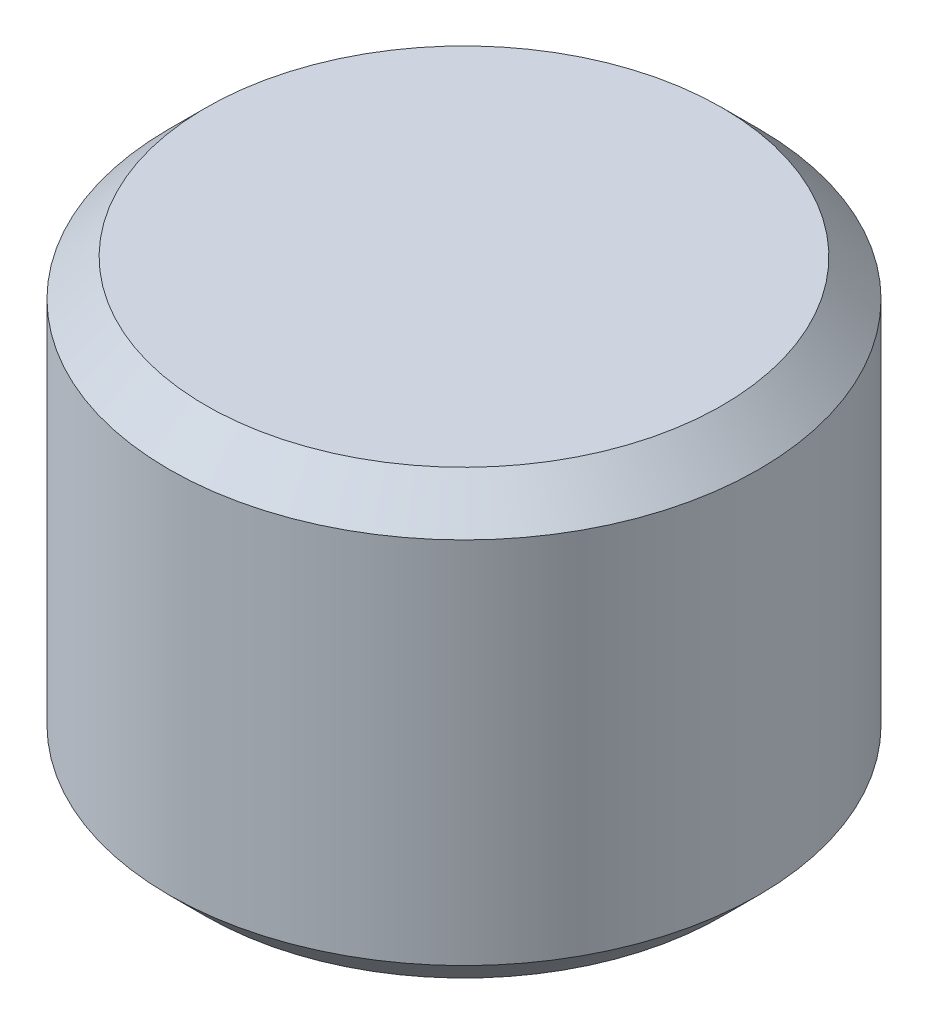
ISO-10303-21;
HEADER;
FILE_DESCRIPTION(('STEP AP214'),'2;1');
FILE_NAME('part.step','',(''),(''),'','','');
FILE_SCHEMA(('AUTOMOTIVE_DESIGN { 1 0 10303 214 1 1 1 1 }'));
ENDSEC;
DATA;
#1=APPLICATION_CONTEXT('core data for automotive mechanical design processes');
#2=APPLICATION_PROTOCOL_DEFINITION('international standard','automotive_design',2000,#1);
#3=PRODUCT_CONTEXT('',#1,'mechanical');
#4=PRODUCT('Part','Part','',(#3));
#5=PRODUCT_RELATED_PRODUCT_CATEGORY('part','',(#4));
#6=PRODUCT_DEFINITION_FORMATION('','',#4);
#7=PRODUCT_DEFINITION_CONTEXT('part definition',#1,'design');
#8=PRODUCT_DEFINITION('design','',#6,#7);
#9=PRODUCT_DEFINITION_SHAPE('','',#8);
#10=(LENGTH_UNIT() NAMED_UNIT(*) SI_UNIT(.MILLI.,.METRE.));
#11=(NAMED_UNIT(*) PLANE_ANGLE_UNIT() SI_UNIT($,.RADIAN.));
#12=(NAMED_UNIT(*) SI_UNIT($,.STERADIAN.) SOLID_ANGLE_UNIT());
#13=UNCERTAINTY_MEASURE_WITH_UNIT(LENGTH_MEASURE(1.E-05),#10,'distance_accuracy_value','');
#14=(GEOMETRIC_REPRESENTATION_CONTEXT(3) GLOBAL_UNCERTAINTY_ASSIGNED_CONTEXT((#13)) GLOBAL_UNIT_ASSIGNED_CONTEXT((#10,
#11,#12)) REPRESENTATION_CONTEXT('',''));
#15=CARTESIAN_POINT('',(0.,0.,0.));
#16=DIRECTION('',(0.,0.,1.));
#17=DIRECTION('',(1.,0.,0.));
#18=AXIS2_PLACEMENT_3D('',#15,#16,#17);
#19=CARTESIAN_POINT('',(0.,0.,0.));
#20=DIRECTION('',(0.,-1.,0.));
#21=DIRECTION('',(0.,0.,-1.));
#22=AXIS2_PLACEMENT_3D('',#19,#20,#21);
#23=PLANE('',#22);
#24=CARTESIAN_POINT('',(0.,0.,0.));
#25=DIRECTION('',(0.,-1.,0.));
#26=DIRECTION('',(0.,0.,-1.));
#27=AXIS2_PLACEMENT_3D('',#24,#25,#26);
#28=CIRCLE('',#27,3.5);
#29=CARTESIAN_POINT('',(0.,0.,-3.5));
#30=VERTEX_POINT('',#29);
#31=EDGE_CURVE('E139',#30,#30,#28,.F.);
#32=ORIENTED_EDGE('',*,*,#31,.T.);
#33=EDGE_LOOP('',(#32));
#34=FACE_BOUND('',#33,.T.);
#35=ADVANCED_FACE('F37',(#34),#23,.F.);
#36=CARTESIAN_POINT('',(0.,0.,0.));
#37=DIRECTION('',(0.,1.,0.));
#38=DIRECTION('',(0.,0.,1.));
#39=AXIS2_PLACEMENT_3D('',#36,#37,#38);
#40=CYLINDRICAL_SURFACE('',#39,4.);
#41=CARTESIAN_POINT('',(0.,-0.500000000000004,0.));
#42=DIRECTION('',(0.,-1.,0.));
#43=DIRECTION('',(0.,0.,-1.));
#44=AXIS2_PLACEMENT_3D('',#41,#42,#43);
#45=CIRCLE('',#44,4.);
#46=CARTESIAN_POINT('',(0.,-0.500000000000004,-4.));
#47=VERTEX_POINT('',#46);
#48=EDGE_CURVE('E45',#47,#47,#45,.T.);
#49=ORIENTED_EDGE('',*,*,#48,.T.);
#50=EDGE_LOOP('',(#49));
#51=FACE_BOUND('',#50,.T.);
#52=CARTESIAN_POINT('',(0.,-5.5,0.));
#53=DIRECTION('',(0.,1.,0.));
#54=DIRECTION('',(0.,0.,1.));
#55=AXIS2_PLACEMENT_3D('',#52,#53,#54);
#56=CIRCLE('',#55,4.);
#57=CARTESIAN_POINT('',(0.,-5.5,4.));
#58=VERTEX_POINT('',#57);
#59=EDGE_CURVE('E147',#58,#58,#56,.T.);
#60=ORIENTED_EDGE('',*,*,#59,.T.);
#61=EDGE_LOOP('',(#60));
#62=FACE_BOUND('',#61,.T.);
#63=ADVANCED_FACE('F152',(#51,#62),#40,.T.);
#64=CARTESIAN_POINT('',(4.,-6.,0.));
#65=DIRECTION('',(0.,1.,0.));
#66=DIRECTION('',(0.,0.,1.));
#67=AXIS2_PLACEMENT_3D('',#64,#65,#66);
#68=PLANE('',#67);
#69=DIRECTION('',(1.,0.,0.));
#70=VECTOR('',#69,1.);
#71=CARTESIAN_POINT('',(-1.15470053837925,-6.,-2.));
#72=LINE('',#71,#70);
#73=CARTESIAN_POINT('',(-1.15470053837925,-6.,-2.));
#74=VERTEX_POINT('',#73);
#75=CARTESIAN_POINT('',(1.15470053837925,-6.,-2.));
#76=VERTEX_POINT('',#75);
#77=EDGE_CURVE('E126',#74,#76,#72,.T.);
#78=ORIENTED_EDGE('',*,*,#77,.F.);
#79=DIRECTION('',(0.5,0.,-0.866025403784439));
#80=VECTOR('',#79,1.);
#81=CARTESIAN_POINT('',(-2.3094010767585,-6.,0.));
#82=LINE('',#81,#80);
#83=CARTESIAN_POINT('',(-2.3094010767585,-6.,0.));
#84=VERTEX_POINT('',#83);
#85=EDGE_CURVE('E52',#84,#74,#82,.T.);
#86=ORIENTED_EDGE('',*,*,#85,.F.);
#87=DIRECTION('',(-0.5,0.,-0.866025403784439));
#88=VECTOR('',#87,1.);
#89=CARTESIAN_POINT('',(-1.15470053837925,-6.,2.));
#90=LINE('',#89,#88);
#91=CARTESIAN_POINT('',(-1.15470053837925,-6.,2.));
#92=VERTEX_POINT('',#91);
#93=EDGE_CURVE('E135',#92,#84,#90,.T.);
#94=ORIENTED_EDGE('',*,*,#93,.F.);
#95=DIRECTION('',(-1.,0.,0.));
#96=VECTOR('',#95,1.);
#97=CARTESIAN_POINT('',(1.15470053837925,-6.,2.));
#98=LINE('',#97,#96);
#99=CARTESIAN_POINT('',(1.15470053837925,-6.,2.));
#100=VERTEX_POINT('',#99);
#101=EDGE_CURVE('E133',#100,#92,#98,.T.);
#102=ORIENTED_EDGE('',*,*,#101,.F.);
#103=DIRECTION('',(-0.5,0.,0.866025403784439));
#104=VECTOR('',#103,1.);
#105=CARTESIAN_POINT('',(2.3094010767585,-6.,0.));
#106=LINE('',#105,#104);
#107=CARTESIAN_POINT('',(2.3094010767585,-6.,0.));
#108=VERTEX_POINT('',#107);
#109=EDGE_CURVE('E100',#108,#100,#106,.T.);
#110=ORIENTED_EDGE('',*,*,#109,.F.);
#111=DIRECTION('',(0.5,0.,0.866025403784439));
#112=VECTOR('',#111,1.);
#113=CARTESIAN_POINT('',(1.15470053837925,-6.,-2.));
#114=LINE('',#113,#112);
#115=EDGE_CURVE('E129',#76,#108,#114,.T.);
#116=ORIENTED_EDGE('',*,*,#115,.F.);
#117=EDGE_LOOP('',(#78,#86,#94,#102,#110,#116));
#118=FACE_BOUND('',#117,.T.);
#119=CARTESIAN_POINT('',(0.,-6.,0.));
#120=DIRECTION('',(0.,1.,0.));
#121=DIRECTION('',(0.,0.,1.));
#122=AXIS2_PLACEMENT_3D('',#119,#120,#121);
#123=CIRCLE('',#122,3.5);
#124=CARTESIAN_POINT('',(0.,-6.,3.5));
#125=VERTEX_POINT('',#124);
#126=EDGE_CURVE('E11',#125,#125,#123,.F.);
#127=ORIENTED_EDGE('',*,*,#126,.T.);
#128=EDGE_LOOP('',(#127));
#129=FACE_BOUND('',#128,.T.);
#130=ADVANCED_FACE('F158',(#118,#129),#68,.F.);
#131=CARTESIAN_POINT('',(0.,0.,0.));
#132=DIRECTION('',(0.,-1.,0.));
#133=DIRECTION('',(0.,0.,-1.));
#134=AXIS2_PLACEMENT_3D('',#131,#132,#133);
#135=CONICAL_SURFACE('',#134,3.5,0.785398163397447);
#136=ORIENTED_EDGE('',*,*,#48,.F.);
#137=EDGE_LOOP('',(#136));
#138=FACE_BOUND('',#137,.T.);
#139=ORIENTED_EDGE('',*,*,#31,.F.);
#140=EDGE_LOOP('',(#139));
#141=FACE_BOUND('',#140,.T.);
#142=ADVANCED_FACE('F155',(#138,#141),#135,.T.);
#143=CARTESIAN_POINT('',(0.,-5.5,0.));
#144=DIRECTION('',(0.,1.,0.));
#145=DIRECTION('',(0.,0.,1.));
#146=AXIS2_PLACEMENT_3D('',#143,#144,#145);
#147=CONICAL_SURFACE('',#146,4.,0.78539816339745);
#148=ORIENTED_EDGE('',*,*,#126,.F.);
#149=EDGE_LOOP('',(#148));
#150=FACE_BOUND('',#149,.T.);
#151=ORIENTED_EDGE('',*,*,#59,.F.);
#152=EDGE_LOOP('',(#151));
#153=FACE_BOUND('',#152,.T.);
#154=ADVANCED_FACE('F39',(#150,#153),#147,.T.);
#155=CARTESIAN_POINT('',(-2.3094010767585,-2.,0.));
#156=DIRECTION('',(-0.866025403784439,0.,-0.5));
#157=DIRECTION('',(-0.5,0.,0.866025403784439));
#158=AXIS2_PLACEMENT_3D('',#155,#156,#157);
#159=PLANE('',#158);
#160=ORIENTED_EDGE('',*,*,#85,.T.);
#161=DIRECTION('',(0.,-1.,0.));
#162=VECTOR('',#161,1.);
#163=CARTESIAN_POINT('',(-1.15470053837925,-2.,-2.));
#164=LINE('',#163,#162);
#165=CARTESIAN_POINT('',(-1.15470053837925,-2.,-2.));
#166=VERTEX_POINT('',#165);
#167=EDGE_CURVE('E82',#166,#74,#164,.T.);
#168=ORIENTED_EDGE('',*,*,#167,.F.);
#169=DIRECTION('',(0.5,0.,-0.866025403784439));
#170=VECTOR('',#169,1.);
#171=CARTESIAN_POINT('',(-2.3094010767585,-2.,0.));
#172=LINE('',#171,#170);
#173=CARTESIAN_POINT('',(-2.3094010767585,-2.,0.));
#174=VERTEX_POINT('',#173);
#175=EDGE_CURVE('E137',#174,#166,#172,.T.);
#176=ORIENTED_EDGE('',*,*,#175,.F.);
#177=DIRECTION('',(0.,-1.,0.));
#178=VECTOR('',#177,1.);
#179=CARTESIAN_POINT('',(-2.3094010767585,-2.,0.));
#180=LINE('',#179,#178);
#181=EDGE_CURVE('E60',#174,#84,#180,.T.);
#182=ORIENTED_EDGE('',*,*,#181,.T.);
#183=EDGE_LOOP('',(#160,#168,#176,#182));
#184=FACE_BOUND('',#183,.T.);
#185=ADVANCED_FACE('F171',(#184),#159,.F.);
#186=CARTESIAN_POINT('',(-1.15470053837925,-2.,2.));
#187=DIRECTION('',(-0.866025403784439,0.,0.5));
#188=DIRECTION('',(0.5,0.,0.866025403784439));
#189=AXIS2_PLACEMENT_3D('',#186,#187,#188);
#190=PLANE('',#189);
#191=ORIENTED_EDGE('',*,*,#93,.T.);
#192=ORIENTED_EDGE('',*,*,#181,.F.);
#193=DIRECTION('',(-0.5,0.,-0.866025403784439));
#194=VECTOR('',#193,1.);
#195=CARTESIAN_POINT('',(-1.15470053837925,-2.,2.));
#196=LINE('',#195,#194);
#197=CARTESIAN_POINT('',(-1.15470053837925,-2.,2.));
#198=VERTEX_POINT('',#197);
#199=EDGE_CURVE('E112',#198,#174,#196,.T.);
#200=ORIENTED_EDGE('',*,*,#199,.F.);
#201=DIRECTION('',(0.,-1.,0.));
#202=VECTOR('',#201,1.);
#203=CARTESIAN_POINT('',(-1.15470053837925,-2.,2.));
#204=LINE('',#203,#202);
#205=EDGE_CURVE('E104',#198,#92,#204,.T.);
#206=ORIENTED_EDGE('',*,*,#205,.T.);
#207=EDGE_LOOP('',(#191,#192,#200,#206));
#208=FACE_BOUND('',#207,.T.);
#209=ADVANCED_FACE('F174',(#208),#190,.F.);
#210=CARTESIAN_POINT('',(1.15470053837925,-2.,2.));
#211=DIRECTION('',(0.,0.,1.));
#212=DIRECTION('',(1.,0.,0.));
#213=AXIS2_PLACEMENT_3D('',#210,#211,#212);
#214=PLANE('',#213);
#215=ORIENTED_EDGE('',*,*,#101,.T.);
#216=ORIENTED_EDGE('',*,*,#205,.F.);
#217=DIRECTION('',(-1.,0.,0.));
#218=VECTOR('',#217,1.);
#219=CARTESIAN_POINT('',(1.15470053837925,-2.,2.));
#220=LINE('',#219,#218);
#221=CARTESIAN_POINT('',(1.15470053837925,-2.,2.));
#222=VERTEX_POINT('',#221);
#223=EDGE_CURVE('E108',#222,#198,#220,.T.);
#224=ORIENTED_EDGE('',*,*,#223,.F.);
#225=DIRECTION('',(0.,-1.,0.));
#226=VECTOR('',#225,1.);
#227=CARTESIAN_POINT('',(1.15470053837925,-2.,2.));
#228=LINE('',#227,#226);
#229=EDGE_CURVE('E93',#222,#100,#228,.T.);
#230=ORIENTED_EDGE('',*,*,#229,.T.);
#231=EDGE_LOOP('',(#215,#216,#224,#230));
#232=FACE_BOUND('',#231,.T.);
#233=ADVANCED_FACE('F109',(#232),#214,.F.);
#234=CARTESIAN_POINT('',(2.3094010767585,-2.,0.));
#235=DIRECTION('',(0.866025403784439,0.,0.5));
#236=DIRECTION('',(0.5,0.,-0.866025403784439));
#237=AXIS2_PLACEMENT_3D('',#234,#235,#236);
#238=PLANE('',#237);
#239=ORIENTED_EDGE('',*,*,#109,.T.);
#240=ORIENTED_EDGE('',*,*,#229,.F.);
#241=DIRECTION('',(-0.5,0.,0.866025403784439));
#242=VECTOR('',#241,1.);
#243=CARTESIAN_POINT('',(2.3094010767585,-2.,0.));
#244=LINE('',#243,#242);
#245=CARTESIAN_POINT('',(2.3094010767585,-2.,0.));
#246=VERTEX_POINT('',#245);
#247=EDGE_CURVE('E97',#246,#222,#244,.T.);
#248=ORIENTED_EDGE('',*,*,#247,.F.);
#249=DIRECTION('',(0.,-1.,0.));
#250=VECTOR('',#249,1.);
#251=CARTESIAN_POINT('',(2.3094010767585,-2.,0.));
#252=LINE('',#251,#250);
#253=EDGE_CURVE('E105',#246,#108,#252,.T.);
#254=ORIENTED_EDGE('',*,*,#253,.T.);
#255=EDGE_LOOP('',(#239,#240,#248,#254));
#256=FACE_BOUND('',#255,.T.);
#257=ADVANCED_FACE('F95',(#256),#238,.F.);
#258=CARTESIAN_POINT('',(1.15470053837925,-2.,-2.));
#259=DIRECTION('',(0.866025403784439,0.,-0.5));
#260=DIRECTION('',(-0.5,0.,-0.866025403784439));
#261=AXIS2_PLACEMENT_3D('',#258,#259,#260);
#262=PLANE('',#261);
#263=ORIENTED_EDGE('',*,*,#115,.T.);
#264=ORIENTED_EDGE('',*,*,#253,.F.);
#265=DIRECTION('',(0.5,0.,0.866025403784439));
#266=VECTOR('',#265,1.);
#267=CARTESIAN_POINT('',(1.15470053837925,-2.,-2.));
#268=LINE('',#267,#266);
#269=CARTESIAN_POINT('',(1.15470053837925,-2.,-2.));
#270=VERTEX_POINT('',#269);
#271=EDGE_CURVE('E118',#270,#246,#268,.T.);
#272=ORIENTED_EDGE('',*,*,#271,.F.);
#273=DIRECTION('',(0.,-1.,0.));
#274=VECTOR('',#273,1.);
#275=CARTESIAN_POINT('',(1.15470053837925,-2.,-2.));
#276=LINE('',#275,#274);
#277=EDGE_CURVE('E142',#270,#76,#276,.T.);
#278=ORIENTED_EDGE('',*,*,#277,.T.);
#279=EDGE_LOOP('',(#263,#264,#272,#278));
#280=FACE_BOUND('',#279,.T.);
#281=ADVANCED_FACE('F178',(#280),#262,.F.);
#282=CARTESIAN_POINT('',(-1.15470053837925,-2.,-2.));
#283=DIRECTION('',(0.,0.,-1.));
#284=DIRECTION('',(-1.,0.,0.));
#285=AXIS2_PLACEMENT_3D('',#282,#283,#284);
#286=PLANE('',#285);
#287=ORIENTED_EDGE('',*,*,#77,.T.);
#288=ORIENTED_EDGE('',*,*,#277,.F.);
#289=DIRECTION('',(1.,0.,0.));
#290=VECTOR('',#289,1.);
#291=CARTESIAN_POINT('',(-1.15470053837925,-2.,-2.));
#292=LINE('',#291,#290);
#293=EDGE_CURVE('E120',#166,#270,#292,.T.);
#294=ORIENTED_EDGE('',*,*,#293,.F.);
#295=ORIENTED_EDGE('',*,*,#167,.T.);
#296=EDGE_LOOP('',(#287,#288,#294,#295));
#297=FACE_BOUND('',#296,.T.);
#298=ADVANCED_FACE('F175',(#297),#286,.F.);
#299=CARTESIAN_POINT('',(0.,-2.,0.));
#300=DIRECTION('',(0.,-1.,0.));
#301=DIRECTION('',(0.,0.,-1.));
#302=AXIS2_PLACEMENT_3D('',#299,#300,#301);
#303=PLANE('',#302);
#304=ORIENTED_EDGE('',*,*,#175,.T.);
#305=ORIENTED_EDGE('',*,*,#293,.T.);
#306=ORIENTED_EDGE('',*,*,#271,.T.);
#307=ORIENTED_EDGE('',*,*,#247,.T.);
#308=ORIENTED_EDGE('',*,*,#223,.T.);
#309=ORIENTED_EDGE('',*,*,#199,.T.);
#310=EDGE_LOOP('',(#304,#305,#306,#307,#308,#309));
#311=FACE_BOUND('',#310,.T.);
#312=ADVANCED_FACE('F115',(#311),#303,.T.);
#313=CLOSED_SHELL('',(#35,#63,#130,#142,#154,#185,#209,#233,#257,#281,#298,#312));
#314=MANIFOLD_SOLID_BREP('B2',#313);
#315=ADVANCED_BREP_SHAPE_REPRESENTATION('',(#18,#314),#14);
#316=SHAPE_DEFINITION_REPRESENTATION(#9,#315);
ENDSEC;
END-ISO-10303-21;
